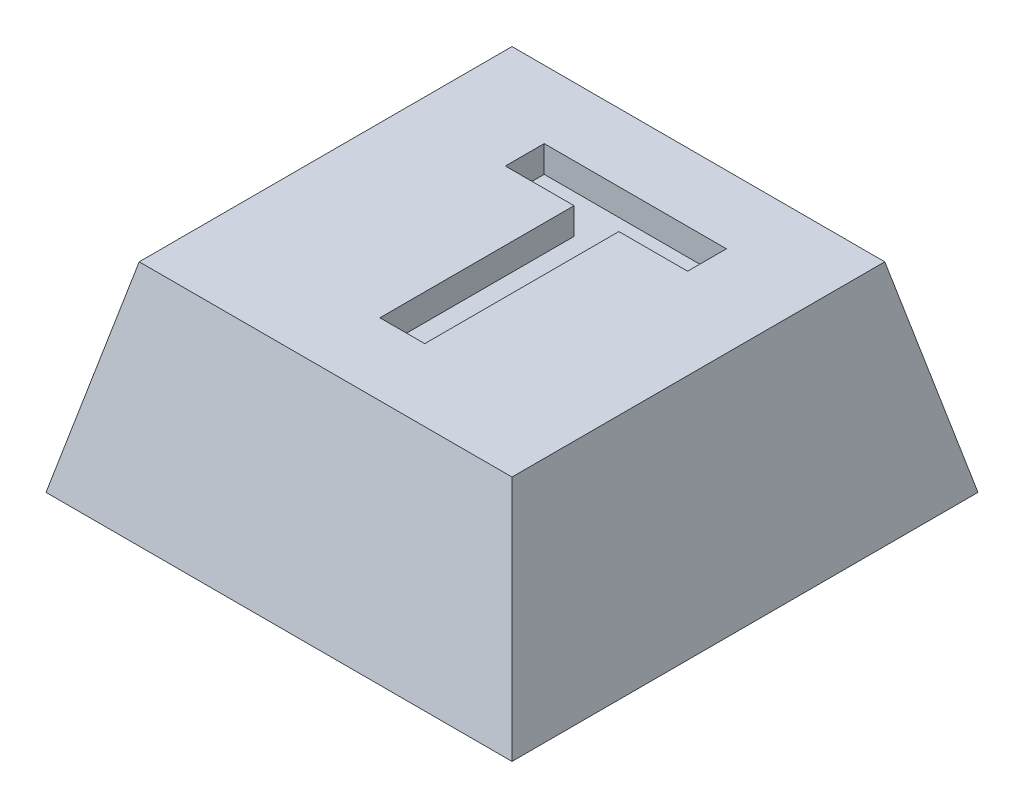
ISO-10303-21;
HEADER;
FILE_DESCRIPTION(('STEP AP214'),'2;1');
FILE_NAME('part.step','',(''),(''),'','','');
FILE_SCHEMA(('AUTOMOTIVE_DESIGN { 1 0 10303 214 1 1 1 1 }'));
ENDSEC;
DATA;
#1=APPLICATION_CONTEXT('core data for automotive mechanical design processes');
#2=APPLICATION_PROTOCOL_DEFINITION('international standard','automotive_design',2000,#1);
#3=PRODUCT_CONTEXT('',#1,'mechanical');
#4=PRODUCT('Part','Part','',(#3));
#5=PRODUCT_RELATED_PRODUCT_CATEGORY('part','',(#4));
#6=PRODUCT_DEFINITION_FORMATION('','',#4);
#7=PRODUCT_DEFINITION_CONTEXT('part definition',#1,'design');
#8=PRODUCT_DEFINITION('design','',#6,#7);
#9=PRODUCT_DEFINITION_SHAPE('','',#8);
#10=(LENGTH_UNIT() NAMED_UNIT(*) SI_UNIT(.MILLI.,.METRE.));
#11=(NAMED_UNIT(*) PLANE_ANGLE_UNIT() SI_UNIT($,.RADIAN.));
#12=(NAMED_UNIT(*) SI_UNIT($,.STERADIAN.) SOLID_ANGLE_UNIT());
#13=UNCERTAINTY_MEASURE_WITH_UNIT(LENGTH_MEASURE(1.E-05),#10,'distance_accuracy_value','');
#14=(GEOMETRIC_REPRESENTATION_CONTEXT(3) GLOBAL_UNCERTAINTY_ASSIGNED_CONTEXT((#13)) GLOBAL_UNIT_ASSIGNED_CONTEXT((#10,
#11,#12)) REPRESENTATION_CONTEXT('',''));
#15=CARTESIAN_POINT('',(0.,0.,0.));
#16=DIRECTION('',(0.,0.,1.));
#17=DIRECTION('',(1.,0.,0.));
#18=AXIS2_PLACEMENT_3D('',#15,#16,#17);
#19=CARTESIAN_POINT('',(0.,3.,0.));
#20=DIRECTION('',(0.,-1.,0.));
#21=DIRECTION('',(0.,0.,-1.));
#22=AXIS2_PLACEMENT_3D('',#19,#20,#21);
#23=PLANE('',#22);
#24=DIRECTION('',(-1.,0.,0.));
#25=VECTOR('',#24,1.);
#26=CARTESIAN_POINT('',(11.,3.,-0.7));
#27=LINE('',#26,#25);
#28=CARTESIAN_POINT('',(6.3,3.,-0.7));
#29=VERTEX_POINT('',#28);
#30=CARTESIAN_POINT('',(0.7,3.,-0.7));
#31=VERTEX_POINT('',#30);
#32=EDGE_CURVE('E66',#29,#31,#27,.T.);
#33=ORIENTED_EDGE('',*,*,#32,.F.);
#34=DIRECTION('',(0.,0.,1.));
#35=VECTOR('',#34,1.);
#36=CARTESIAN_POINT('',(6.3,3.,-7.));
#37=LINE('',#36,#35);
#38=CARTESIAN_POINT('',(6.3,3.,-6.3));
#39=VERTEX_POINT('',#38);
#40=EDGE_CURVE('E183',#39,#29,#37,.T.);
#41=ORIENTED_EDGE('',*,*,#40,.F.);
#42=DIRECTION('',(-1.,0.,0.));
#43=VECTOR('',#42,1.);
#44=CARTESIAN_POINT('',(11.,3.,-6.3));
#45=LINE('',#44,#43);
#46=CARTESIAN_POINT('',(0.699999999999998,3.,-6.3));
#47=VERTEX_POINT('',#46);
#48=EDGE_CURVE('E170',#39,#47,#45,.T.);
#49=ORIENTED_EDGE('',*,*,#48,.T.);
#50=DIRECTION('',(0.,0.,1.));
#51=VECTOR('',#50,1.);
#52=CARTESIAN_POINT('',(0.7,3.,-7.));
#53=LINE('',#52,#51);
#54=EDGE_CURVE('E184',#47,#31,#53,.T.);
#55=ORIENTED_EDGE('',*,*,#54,.T.);
#56=EDGE_LOOP('',(#33,#41,#49,#55));
#57=FACE_BOUND('',#56,.T.);
#58=DIRECTION('',(-1.,0.,0.));
#59=VECTOR('',#58,1.);
#60=CARTESIAN_POINT('',(3.90938645226509,3.,-1.77952325444804));
#61=LINE('',#60,#59);
#62=CARTESIAN_POINT('',(3.90938645226509,3.,-1.77952325444804));
#63=VERTEX_POINT('',#62);
#64=CARTESIAN_POINT('',(3.23630952918817,3.,-1.77952325444804));
#65=VERTEX_POINT('',#64);
#66=EDGE_CURVE('E59',#63,#65,#61,.T.);
#67=ORIENTED_EDGE('',*,*,#66,.T.);
#68=DIRECTION('',(0.,0.,-1.));
#69=VECTOR('',#68,1.);
#70=CARTESIAN_POINT('',(3.23630952918817,3.,-1.77952325444804));
#71=LINE('',#70,#69);
#72=CARTESIAN_POINT('',(3.23630952918817,3.,-4.69618992111471));
#73=VERTEX_POINT('',#72);
#74=EDGE_CURVE('E154',#65,#73,#71,.T.);
#75=ORIENTED_EDGE('',*,*,#74,.T.);
#76=DIRECTION('',(-1.,0.,0.));
#77=VECTOR('',#76,1.);
#78=CARTESIAN_POINT('',(3.23630952918817,3.,-4.69618992111471));
#79=LINE('',#78,#77);
#80=CARTESIAN_POINT('',(2.20425824713688,3.,-4.69618992111471));
#81=VERTEX_POINT('',#80);
#82=EDGE_CURVE('E449',#73,#81,#79,.T.);
#83=ORIENTED_EDGE('',*,*,#82,.T.);
#84=DIRECTION('',(0.,0.,-1.));
#85=VECTOR('',#84,1.);
#86=CARTESIAN_POINT('',(2.20425824713688,3.,-4.69618992111471));
#87=LINE('',#86,#85);
#88=CARTESIAN_POINT('',(2.20425824713688,3.,-5.27952325444804));
#89=VERTEX_POINT('',#88);
#90=EDGE_CURVE('E451',#81,#89,#87,.T.);
#91=ORIENTED_EDGE('',*,*,#90,.T.);
#92=DIRECTION('',(1.,0.,0.));
#93=VECTOR('',#92,1.);
#94=CARTESIAN_POINT('',(2.20425824713688,3.,-5.27952325444804));
#95=LINE('',#94,#93);
#96=CARTESIAN_POINT('',(4.94143773431637,3.,-5.27952325444804));
#97=VERTEX_POINT('',#96);
#98=EDGE_CURVE('E427',#89,#97,#95,.T.);
#99=ORIENTED_EDGE('',*,*,#98,.T.);
#100=DIRECTION('',(0.,0.,1.));
#101=VECTOR('',#100,1.);
#102=CARTESIAN_POINT('',(4.94143773431637,3.,-5.27952325444804));
#103=LINE('',#102,#101);
#104=CARTESIAN_POINT('',(4.94143773431637,3.,-4.69618992111471));
#105=VERTEX_POINT('',#104);
#106=EDGE_CURVE('E422',#97,#105,#103,.T.);
#107=ORIENTED_EDGE('',*,*,#106,.T.);
#108=DIRECTION('',(-1.,0.,0.));
#109=VECTOR('',#108,1.);
#110=CARTESIAN_POINT('',(4.94143773431637,3.,-4.69618992111471));
#111=LINE('',#110,#109);
#112=CARTESIAN_POINT('',(3.90938645226509,3.,-4.69618992111471));
#113=VERTEX_POINT('',#112);
#114=EDGE_CURVE('E416',#105,#113,#111,.T.);
#115=ORIENTED_EDGE('',*,*,#114,.T.);
#116=DIRECTION('',(0.,0.,1.));
#117=VECTOR('',#116,1.);
#118=CARTESIAN_POINT('',(3.90938645226509,3.,-4.69618992111471));
#119=LINE('',#118,#117);
#120=EDGE_CURVE('E150',#113,#63,#119,.T.);
#121=ORIENTED_EDGE('',*,*,#120,.T.);
#122=EDGE_LOOP('',(#67,#75,#83,#91,#99,#107,#115,#121));
#123=FACE_BOUND('',#122,.T.);
#124=ADVANCED_FACE('F43',(#57,#123),#23,.F.);
#125=CARTESIAN_POINT('',(7.,0.,-7.));
#126=DIRECTION('',(-0.973841209741793,-0.227229615606418,0.));
#127=DIRECTION('',(0.227229615606418,-0.973841209741793,0.));
#128=AXIS2_PLACEMENT_3D('',#125,#126,#127);
#129=PLANE('',#128);
#130=DIRECTION('',(-0.221581128241521,0.949633406749377,-0.221581128241521));
#131=VECTOR('',#130,1.);
#132=CARTESIAN_POINT('',(6.6563126252505,1.47294589178357,-0.343687374749499));
#133=LINE('',#132,#131);
#134=CARTESIAN_POINT('',(7.,0.,0.));
#135=VERTEX_POINT('',#134);
#136=EDGE_CURVE('E180',#135,#29,#133,.T.);
#137=ORIENTED_EDGE('',*,*,#136,.F.);
#138=DIRECTION('',(0.,0.,-1.));
#139=VECTOR('',#138,1.);
#140=CARTESIAN_POINT('',(7.,0.,0.));
#141=LINE('',#140,#139);
#142=CARTESIAN_POINT('',(7.,0.,-7.));
#143=VERTEX_POINT('',#142);
#144=EDGE_CURVE('E198',#135,#143,#141,.T.);
#145=ORIENTED_EDGE('',*,*,#144,.T.);
#146=DIRECTION('',(0.221581128241521,-0.949633406749377,-0.221581128241521));
#147=VECTOR('',#146,1.);
#148=CARTESIAN_POINT('',(7.,0.,-7.));
#149=LINE('',#148,#147);
#150=EDGE_CURVE('E174',#39,#143,#149,.T.);
#151=ORIENTED_EDGE('',*,*,#150,.F.);
#152=ORIENTED_EDGE('',*,*,#40,.T.);
#153=EDGE_LOOP('',(#137,#145,#151,#152));
#154=FACE_BOUND('',#153,.T.);
#155=ADVANCED_FACE('F223',(#154),#129,.F.);
#156=CARTESIAN_POINT('',(0.,0.,-7.));
#157=DIRECTION('',(0.973841209741793,-0.227229615606418,0.));
#158=DIRECTION('',(0.227229615606418,0.973841209741793,0.));
#159=AXIS2_PLACEMENT_3D('',#156,#157,#158);
#160=PLANE('',#159);
#161=DIRECTION('',(-0.221581128241521,-0.949633406749378,0.221581128241521));
#162=VECTOR('',#161,1.);
#163=CARTESIAN_POINT('',(0.343687374749499,1.47294589178357,-0.3436873747495));
#164=LINE('',#163,#162);
#165=CARTESIAN_POINT('',(0.,0.,0.));
#166=VERTEX_POINT('',#165);
#167=EDGE_CURVE('E11',#31,#166,#164,.T.);
#168=ORIENTED_EDGE('',*,*,#167,.F.);
#169=ORIENTED_EDGE('',*,*,#54,.F.);
#170=DIRECTION('',(0.221581128241521,0.949633406749377,0.221581128241521));
#171=VECTOR('',#170,1.);
#172=CARTESIAN_POINT('',(0.,0.,-7.));
#173=LINE('',#172,#171);
#174=CARTESIAN_POINT('',(0.,0.,-7.));
#175=VERTEX_POINT('',#174);
#176=EDGE_CURVE('E52',#175,#47,#173,.T.);
#177=ORIENTED_EDGE('',*,*,#176,.F.);
#178=DIRECTION('',(0.,0.,1.));
#179=VECTOR('',#178,1.);
#180=CARTESIAN_POINT('',(0.,0.,0.));
#181=LINE('',#180,#179);
#182=EDGE_CURVE('E188',#175,#166,#181,.T.);
#183=ORIENTED_EDGE('',*,*,#182,.T.);
#184=EDGE_LOOP('',(#168,#169,#177,#183));
#185=FACE_BOUND('',#184,.T.);
#186=ADVANCED_FACE('F216',(#185),#160,.F.);
#187=CARTESIAN_POINT('',(0.,0.,0.));
#188=DIRECTION('',(0.,-1.,0.));
#189=DIRECTION('',(0.,0.,-1.));
#190=AXIS2_PLACEMENT_3D('',#187,#188,#189);
#191=PLANE('',#190);
#192=CARTESIAN_POINT('',(3.5,0.,-3.5));
#193=DIRECTION('',(0.,-1.,0.));
#194=DIRECTION('',(0.,0.,-1.));
#195=AXIS2_PLACEMENT_3D('',#192,#193,#194);
#196=CIRCLE('',#195,1.8);
#197=CARTESIAN_POINT('',(3.5,0.,-5.3));
#198=VERTEX_POINT('',#197);
#199=EDGE_CURVE('E156',#198,#198,#196,.T.);
#200=ORIENTED_EDGE('',*,*,#199,.F.);
#201=EDGE_LOOP('',(#200));
#202=FACE_BOUND('',#201,.T.);
#203=ORIENTED_EDGE('',*,*,#182,.F.);
#204=DIRECTION('',(-1.,0.,0.));
#205=VECTOR('',#204,1.);
#206=CARTESIAN_POINT('',(0.,0.,-7.));
#207=LINE('',#206,#205);
#208=EDGE_CURVE('E202',#143,#175,#207,.T.);
#209=ORIENTED_EDGE('',*,*,#208,.F.);
#210=ORIENTED_EDGE('',*,*,#144,.F.);
#211=DIRECTION('',(1.,0.,0.));
#212=VECTOR('',#211,1.);
#213=CARTESIAN_POINT('',(0.,0.,0.));
#214=LINE('',#213,#212);
#215=EDGE_CURVE('E195',#166,#135,#214,.T.);
#216=ORIENTED_EDGE('',*,*,#215,.F.);
#217=EDGE_LOOP('',(#203,#209,#210,#216));
#218=FACE_BOUND('',#217,.T.);
#219=ADVANCED_FACE('F45',(#202,#218),#191,.T.);
#220=CARTESIAN_POINT('',(11.,3.,-6.3));
#221=DIRECTION('',(0.,0.227229615606418,-0.973841209741793));
#222=DIRECTION('',(0.,0.973841209741793,0.227229615606418));
#223=AXIS2_PLACEMENT_3D('',#220,#221,#222);
#224=PLANE('',#223);
#225=ORIENTED_EDGE('',*,*,#150,.T.);
#226=ORIENTED_EDGE('',*,*,#208,.T.);
#227=ORIENTED_EDGE('',*,*,#176,.T.);
#228=ORIENTED_EDGE('',*,*,#48,.F.);
#229=EDGE_LOOP('',(#225,#226,#227,#228));
#230=FACE_BOUND('',#229,.T.);
#231=ADVANCED_FACE('F207',(#230),#224,.T.);
#232=CARTESIAN_POINT('',(11.,0.,0.));
#233=DIRECTION('',(0.,0.227229615606418,0.973841209741793));
#234=DIRECTION('',(0.,-0.973841209741793,0.227229615606418));
#235=AXIS2_PLACEMENT_3D('',#232,#233,#234);
#236=PLANE('',#235);
#237=ORIENTED_EDGE('',*,*,#136,.T.);
#238=ORIENTED_EDGE('',*,*,#32,.T.);
#239=ORIENTED_EDGE('',*,*,#167,.T.);
#240=ORIENTED_EDGE('',*,*,#215,.T.);
#241=EDGE_LOOP('',(#237,#238,#239,#240));
#242=FACE_BOUND('',#241,.T.);
#243=ADVANCED_FACE('F218',(#242),#236,.T.);
#244=CARTESIAN_POINT('',(3.5,0.8,-3.5));
#245=DIRECTION('',(0.,-1.,0.));
#246=DIRECTION('',(0.,0.,-1.));
#247=AXIS2_PLACEMENT_3D('',#244,#245,#246);
#248=CYLINDRICAL_SURFACE('',#247,1.8);
#249=CARTESIAN_POINT('',(3.5,0.8,-3.5));
#250=DIRECTION('',(0.,-1.,0.));
#251=DIRECTION('',(0.,0.,-1.));
#252=AXIS2_PLACEMENT_3D('',#249,#250,#251);
#253=CIRCLE('',#252,1.8);
#254=CARTESIAN_POINT('',(3.5,0.8,-5.3));
#255=VERTEX_POINT('',#254);
#256=EDGE_CURVE('E162',#255,#255,#253,.T.);
#257=ORIENTED_EDGE('',*,*,#256,.F.);
#258=EDGE_LOOP('',(#257));
#259=FACE_BOUND('',#258,.T.);
#260=ORIENTED_EDGE('',*,*,#199,.T.);
#261=EDGE_LOOP('',(#260));
#262=FACE_BOUND('',#261,.T.);
#263=ADVANCED_FACE('F241',(#259,#262),#248,.F.);
#264=CARTESIAN_POINT('',(3.5,0.8,-3.5));
#265=DIRECTION('',(0.,-1.,0.));
#266=DIRECTION('',(0.,0.,-1.));
#267=AXIS2_PLACEMENT_3D('',#264,#265,#266);
#268=PLANE('',#267);
#269=ORIENTED_EDGE('',*,*,#256,.T.);
#270=EDGE_LOOP('',(#269));
#271=FACE_BOUND('',#270,.T.);
#272=ADVANCED_FACE('F244',(#271),#268,.T.);
#273=CARTESIAN_POINT('',(3.90938645226509,2.6,-1.77952325444804));
#274=DIRECTION('',(0.,0.,-1.));
#275=DIRECTION('',(-1.,0.,0.));
#276=AXIS2_PLACEMENT_3D('',#273,#274,#275);
#277=PLANE('',#276);
#278=ORIENTED_EDGE('',*,*,#66,.F.);
#279=DIRECTION('',(0.,1.,0.));
#280=VECTOR('',#279,1.);
#281=CARTESIAN_POINT('',(3.90938645226509,2.6,-1.77952325444804));
#282=LINE('',#281,#280);
#283=CARTESIAN_POINT('',(3.90938645226509,2.6,-1.77952325444804));
#284=VERTEX_POINT('',#283);
#285=EDGE_CURVE('E148',#284,#63,#282,.T.);
#286=ORIENTED_EDGE('',*,*,#285,.F.);
#287=DIRECTION('',(-1.,0.,0.));
#288=VECTOR('',#287,1.);
#289=CARTESIAN_POINT('',(3.90938645226509,2.6,-1.77952325444804));
#290=LINE('',#289,#288);
#291=CARTESIAN_POINT('',(3.23630952918817,2.6,-1.77952325444804));
#292=VERTEX_POINT('',#291);
#293=EDGE_CURVE('E138',#284,#292,#290,.T.);
#294=ORIENTED_EDGE('',*,*,#293,.T.);
#295=DIRECTION('',(0.,1.,0.));
#296=VECTOR('',#295,1.);
#297=CARTESIAN_POINT('',(3.23630952918817,2.6,-1.77952325444804));
#298=LINE('',#297,#296);
#299=EDGE_CURVE('E147',#292,#65,#298,.T.);
#300=ORIENTED_EDGE('',*,*,#299,.T.);
#301=EDGE_LOOP('',(#278,#286,#294,#300));
#302=FACE_BOUND('',#301,.T.);
#303=ADVANCED_FACE('F146',(#302),#277,.T.);
#304=CARTESIAN_POINT('',(3.23630952918817,2.6,-1.77952325444804));
#305=DIRECTION('',(1.,0.,0.));
#306=DIRECTION('',(0.,0.,-1.));
#307=AXIS2_PLACEMENT_3D('',#304,#305,#306);
#308=PLANE('',#307);
#309=ORIENTED_EDGE('',*,*,#74,.F.);
#310=ORIENTED_EDGE('',*,*,#299,.F.);
#311=DIRECTION('',(0.,0.,-1.));
#312=VECTOR('',#311,1.);
#313=CARTESIAN_POINT('',(3.23630952918817,2.6,-1.77952325444804));
#314=LINE('',#313,#312);
#315=CARTESIAN_POINT('',(3.23630952918817,2.6,-4.69618992111471));
#316=VERTEX_POINT('',#315);
#317=EDGE_CURVE('E134',#292,#316,#314,.T.);
#318=ORIENTED_EDGE('',*,*,#317,.T.);
#319=DIRECTION('',(0.,1.,0.));
#320=VECTOR('',#319,1.);
#321=CARTESIAN_POINT('',(3.23630952918817,2.6,-4.69618992111471));
#322=LINE('',#321,#320);
#323=EDGE_CURVE('E157',#316,#73,#322,.T.);
#324=ORIENTED_EDGE('',*,*,#323,.T.);
#325=EDGE_LOOP('',(#309,#310,#318,#324));
#326=FACE_BOUND('',#325,.T.);
#327=ADVANCED_FACE('F152',(#326),#308,.T.);
#328=CARTESIAN_POINT('',(3.23630952918817,2.6,-4.69618992111471));
#329=DIRECTION('',(0.,0.,-1.));
#330=DIRECTION('',(-1.,0.,0.));
#331=AXIS2_PLACEMENT_3D('',#328,#329,#330);
#332=PLANE('',#331);
#333=ORIENTED_EDGE('',*,*,#82,.F.);
#334=ORIENTED_EDGE('',*,*,#323,.F.);
#335=DIRECTION('',(-1.,0.,0.));
#336=VECTOR('',#335,1.);
#337=CARTESIAN_POINT('',(3.23630952918817,2.6,-4.69618992111471));
#338=LINE('',#337,#336);
#339=CARTESIAN_POINT('',(2.20425824713688,2.6,-4.69618992111471));
#340=VERTEX_POINT('',#339);
#341=EDGE_CURVE('E140',#316,#340,#338,.T.);
#342=ORIENTED_EDGE('',*,*,#341,.T.);
#343=DIRECTION('',(0.,1.,0.));
#344=VECTOR('',#343,1.);
#345=CARTESIAN_POINT('',(2.20425824713688,2.6,-4.69618992111471));
#346=LINE('',#345,#344);
#347=EDGE_CURVE('E164',#340,#81,#346,.T.);
#348=ORIENTED_EDGE('',*,*,#347,.T.);
#349=EDGE_LOOP('',(#333,#334,#342,#348));
#350=FACE_BOUND('',#349,.T.);
#351=ADVANCED_FACE('F253',(#350),#332,.T.);
#352=CARTESIAN_POINT('',(2.20425824713688,2.6,-4.69618992111471));
#353=DIRECTION('',(1.,0.,0.));
#354=DIRECTION('',(0.,0.,-1.));
#355=AXIS2_PLACEMENT_3D('',#352,#353,#354);
#356=PLANE('',#355);
#357=ORIENTED_EDGE('',*,*,#90,.F.);
#358=ORIENTED_EDGE('',*,*,#347,.F.);
#359=DIRECTION('',(0.,0.,-1.));
#360=VECTOR('',#359,1.);
#361=CARTESIAN_POINT('',(2.20425824713688,2.6,-4.69618992111471));
#362=LINE('',#361,#360);
#363=CARTESIAN_POINT('',(2.20425824713688,2.6,-5.27952325444804));
#364=VERTEX_POINT('',#363);
#365=EDGE_CURVE('E479',#340,#364,#362,.T.);
#366=ORIENTED_EDGE('',*,*,#365,.T.);
#367=DIRECTION('',(0.,1.,0.));
#368=VECTOR('',#367,1.);
#369=CARTESIAN_POINT('',(2.20425824713688,2.6,-5.27952325444804));
#370=LINE('',#369,#368);
#371=EDGE_CURVE('E442',#364,#89,#370,.T.);
#372=ORIENTED_EDGE('',*,*,#371,.T.);
#373=EDGE_LOOP('',(#357,#358,#366,#372));
#374=FACE_BOUND('',#373,.T.);
#375=ADVANCED_FACE('F256',(#374),#356,.T.);
#376=CARTESIAN_POINT('',(2.20425824713688,2.6,-5.27952325444804));
#377=DIRECTION('',(0.,0.,1.));
#378=DIRECTION('',(1.,0.,0.));
#379=AXIS2_PLACEMENT_3D('',#376,#377,#378);
#380=PLANE('',#379);
#381=ORIENTED_EDGE('',*,*,#98,.F.);
#382=ORIENTED_EDGE('',*,*,#371,.F.);
#383=DIRECTION('',(1.,0.,0.));
#384=VECTOR('',#383,1.);
#385=CARTESIAN_POINT('',(2.20425824713688,2.6,-5.27952325444804));
#386=LINE('',#385,#384);
#387=CARTESIAN_POINT('',(4.94143773431637,2.6,-5.27952325444804));
#388=VERTEX_POINT('',#387);
#389=EDGE_CURVE('E464',#364,#388,#386,.T.);
#390=ORIENTED_EDGE('',*,*,#389,.T.);
#391=DIRECTION('',(0.,1.,0.));
#392=VECTOR('',#391,1.);
#393=CARTESIAN_POINT('',(4.94143773431637,2.6,-5.27952325444804));
#394=LINE('',#393,#392);
#395=EDGE_CURVE('E439',#388,#97,#394,.T.);
#396=ORIENTED_EDGE('',*,*,#395,.T.);
#397=EDGE_LOOP('',(#381,#382,#390,#396));
#398=FACE_BOUND('',#397,.T.);
#399=ADVANCED_FACE('F260',(#398),#380,.T.);
#400=CARTESIAN_POINT('',(4.94143773431637,2.6,-5.27952325444804));
#401=DIRECTION('',(-1.,0.,0.));
#402=DIRECTION('',(0.,0.,1.));
#403=AXIS2_PLACEMENT_3D('',#400,#401,#402);
#404=PLANE('',#403);
#405=ORIENTED_EDGE('',*,*,#106,.F.);
#406=ORIENTED_EDGE('',*,*,#395,.F.);
#407=DIRECTION('',(0.,0.,1.));
#408=VECTOR('',#407,1.);
#409=CARTESIAN_POINT('',(4.94143773431637,2.6,-5.27952325444804));
#410=LINE('',#409,#408);
#411=CARTESIAN_POINT('',(4.94143773431637,2.6,-4.69618992111471));
#412=VERTEX_POINT('',#411);
#413=EDGE_CURVE('E466',#388,#412,#410,.T.);
#414=ORIENTED_EDGE('',*,*,#413,.T.);
#415=DIRECTION('',(0.,1.,0.));
#416=VECTOR('',#415,1.);
#417=CARTESIAN_POINT('',(4.94143773431637,2.6,-4.69618992111471));
#418=LINE('',#417,#416);
#419=EDGE_CURVE('E436',#412,#105,#418,.T.);
#420=ORIENTED_EDGE('',*,*,#419,.T.);
#421=EDGE_LOOP('',(#405,#406,#414,#420));
#422=FACE_BOUND('',#421,.T.);
#423=ADVANCED_FACE('F264',(#422),#404,.T.);
#424=CARTESIAN_POINT('',(4.94143773431637,2.6,-4.69618992111471));
#425=DIRECTION('',(0.,0.,-1.));
#426=DIRECTION('',(-1.,0.,0.));
#427=AXIS2_PLACEMENT_3D('',#424,#425,#426);
#428=PLANE('',#427);
#429=ORIENTED_EDGE('',*,*,#114,.F.);
#430=ORIENTED_EDGE('',*,*,#419,.F.);
#431=DIRECTION('',(-1.,0.,0.));
#432=VECTOR('',#431,1.);
#433=CARTESIAN_POINT('',(4.94143773431637,2.6,-4.69618992111471));
#434=LINE('',#433,#432);
#435=CARTESIAN_POINT('',(3.90938645226509,2.6,-4.69618992111471));
#436=VERTEX_POINT('',#435);
#437=EDGE_CURVE('E468',#412,#436,#434,.T.);
#438=ORIENTED_EDGE('',*,*,#437,.T.);
#439=DIRECTION('',(0.,1.,0.));
#440=VECTOR('',#439,1.);
#441=CARTESIAN_POINT('',(3.90938645226509,2.6,-4.69618992111471));
#442=LINE('',#441,#440);
#443=EDGE_CURVE('E414',#436,#113,#442,.T.);
#444=ORIENTED_EDGE('',*,*,#443,.T.);
#445=EDGE_LOOP('',(#429,#430,#438,#444));
#446=FACE_BOUND('',#445,.T.);
#447=ADVANCED_FACE('F268',(#446),#428,.T.);
#448=CARTESIAN_POINT('',(3.90938645226509,2.6,-4.69618992111471));
#449=DIRECTION('',(-1.,0.,0.));
#450=DIRECTION('',(0.,0.,1.));
#451=AXIS2_PLACEMENT_3D('',#448,#449,#450);
#452=PLANE('',#451);
#453=ORIENTED_EDGE('',*,*,#120,.F.);
#454=ORIENTED_EDGE('',*,*,#443,.F.);
#455=DIRECTION('',(0.,0.,1.));
#456=VECTOR('',#455,1.);
#457=CARTESIAN_POINT('',(3.90938645226509,2.6,-4.69618992111471));
#458=LINE('',#457,#456);
#459=EDGE_CURVE('E433',#436,#284,#458,.T.);
#460=ORIENTED_EDGE('',*,*,#459,.T.);
#461=ORIENTED_EDGE('',*,*,#285,.T.);
#462=EDGE_LOOP('',(#453,#454,#460,#461));
#463=FACE_BOUND('',#462,.T.);
#464=ADVANCED_FACE('F272',(#463),#452,.T.);
#465=CARTESIAN_POINT('',(0.,2.6,0.));
#466=DIRECTION('',(0.,-1.,0.));
#467=DIRECTION('',(0.,0.,-1.));
#468=AXIS2_PLACEMENT_3D('',#465,#466,#467);
#469=PLANE('',#468);
#470=ORIENTED_EDGE('',*,*,#293,.F.);
#471=ORIENTED_EDGE('',*,*,#459,.F.);
#472=ORIENTED_EDGE('',*,*,#437,.F.);
#473=ORIENTED_EDGE('',*,*,#413,.F.);
#474=ORIENTED_EDGE('',*,*,#389,.F.);
#475=ORIENTED_EDGE('',*,*,#365,.F.);
#476=ORIENTED_EDGE('',*,*,#341,.F.);
#477=ORIENTED_EDGE('',*,*,#317,.F.);
#478=EDGE_LOOP('',(#470,#471,#472,#473,#474,#475,#476,#477));
#479=FACE_BOUND('',#478,.T.);
#480=ADVANCED_FACE('F136',(#479),#469,.F.);
#481=CLOSED_SHELL('',(#124,#155,#186,#219,#231,#243,#263,#272,#303,#327,#351,#375,#399,#423,
#447,#464,#480));
#482=MANIFOLD_SOLID_BREP('B2',#481);
#483=ADVANCED_BREP_SHAPE_REPRESENTATION('',(#18,#482),#14);
#484=SHAPE_DEFINITION_REPRESENTATION(#9,#483);
ENDSEC;
END-ISO-10303-21;
